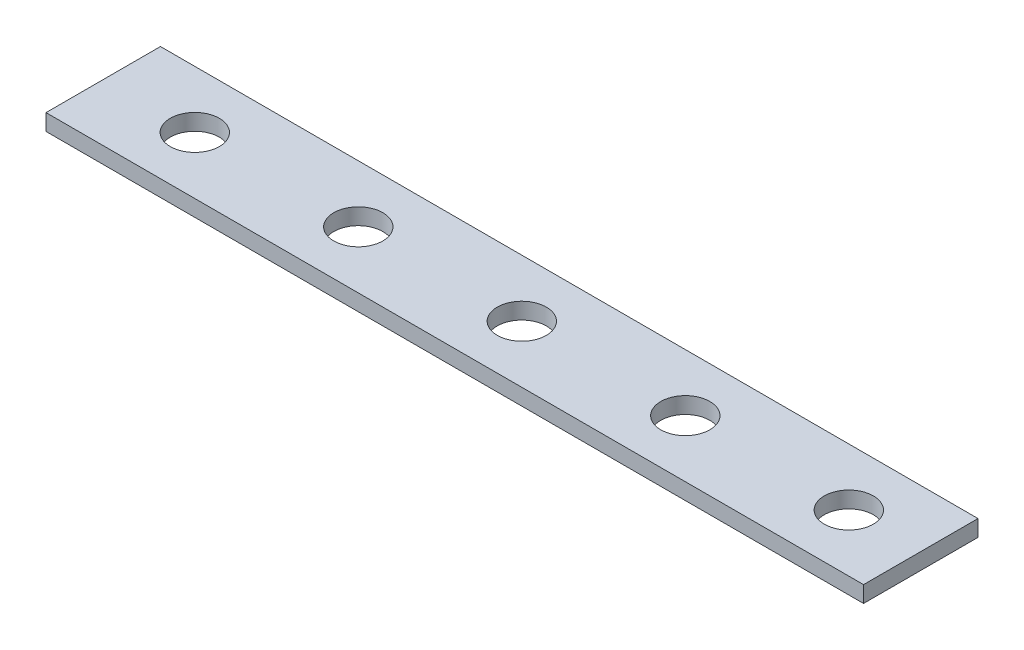
ISO-10303-21;
HEADER;
FILE_DESCRIPTION(('STEP AP214'),'2;1');
FILE_NAME('part.step','',(''),(''),'','','');
FILE_SCHEMA(('AUTOMOTIVE_DESIGN { 1 0 10303 214 1 1 1 1 }'));
ENDSEC;
DATA;
#1=APPLICATION_CONTEXT('core data for automotive mechanical design processes');
#2=APPLICATION_PROTOCOL_DEFINITION('international standard','automotive_design',2000,#1);
#3=PRODUCT_CONTEXT('',#1,'mechanical');
#4=PRODUCT('Part','Part','',(#3));
#5=PRODUCT_RELATED_PRODUCT_CATEGORY('part','',(#4));
#6=PRODUCT_DEFINITION_FORMATION('','',#4);
#7=PRODUCT_DEFINITION_CONTEXT('part definition',#1,'design');
#8=PRODUCT_DEFINITION('design','',#6,#7);
#9=PRODUCT_DEFINITION_SHAPE('','',#8);
#10=(LENGTH_UNIT() NAMED_UNIT(*) SI_UNIT(.MILLI.,.METRE.));
#11=(NAMED_UNIT(*) PLANE_ANGLE_UNIT() SI_UNIT($,.RADIAN.));
#12=(NAMED_UNIT(*) SI_UNIT($,.STERADIAN.) SOLID_ANGLE_UNIT());
#13=UNCERTAINTY_MEASURE_WITH_UNIT(LENGTH_MEASURE(1.E-05),#10,'distance_accuracy_value','');
#14=(GEOMETRIC_REPRESENTATION_CONTEXT(3) GLOBAL_UNCERTAINTY_ASSIGNED_CONTEXT((#13)) GLOBAL_UNIT_ASSIGNED_CONTEXT((#10,
#11,#12)) REPRESENTATION_CONTEXT('',''));
#15=CARTESIAN_POINT('',(0.,0.,0.));
#16=DIRECTION('',(0.,0.,1.));
#17=DIRECTION('',(1.,0.,0.));
#18=AXIS2_PLACEMENT_3D('',#15,#16,#17);
#19=CARTESIAN_POINT('',(-33.6,1.,-18.3166666666667));
#20=DIRECTION('',(1.,0.,0.));
#21=DIRECTION('',(0.,0.,-1.));
#22=AXIS2_PLACEMENT_3D('',#19,#20,#21);
#23=PLANE('',#22);
#24=DIRECTION('',(0.,0.,1.));
#25=VECTOR('',#24,1.);
#26=CARTESIAN_POINT('',(-33.6,0.,-18.3166666666667));
#27=LINE('',#26,#25);
#28=CARTESIAN_POINT('',(-33.6,0.,-18.3166666666667));
#29=VERTEX_POINT('',#28);
#30=CARTESIAN_POINT('',(-33.6,0.,-11.3166666666667));
#31=VERTEX_POINT('',#30);
#32=EDGE_CURVE('E102',#29,#31,#27,.T.);
#33=ORIENTED_EDGE('',*,*,#32,.T.);
#34=DIRECTION('',(0.,-1.,0.));
#35=VECTOR('',#34,1.);
#36=CARTESIAN_POINT('',(-33.6,1.,-11.3166666666667));
#37=LINE('',#36,#35);
#38=CARTESIAN_POINT('',(-33.6,1.,-11.3166666666667));
#39=VERTEX_POINT('',#38);
#40=EDGE_CURVE('E93',#39,#31,#37,.T.);
#41=ORIENTED_EDGE('',*,*,#40,.F.);
#42=DIRECTION('',(0.,0.,1.));
#43=VECTOR('',#42,1.);
#44=CARTESIAN_POINT('',(-33.6,1.,-18.3166666666667));
#45=LINE('',#44,#43);
#46=CARTESIAN_POINT('',(-33.6,1.,-18.3166666666667));
#47=VERTEX_POINT('',#46);
#48=EDGE_CURVE('E87',#47,#39,#45,.T.);
#49=ORIENTED_EDGE('',*,*,#48,.F.);
#50=DIRECTION('',(0.,-1.,0.));
#51=VECTOR('',#50,1.);
#52=CARTESIAN_POINT('',(-33.6,1.,-18.3166666666667));
#53=LINE('',#52,#51);
#54=EDGE_CURVE('E98',#47,#29,#53,.T.);
#55=ORIENTED_EDGE('',*,*,#54,.T.);
#56=EDGE_LOOP('',(#33,#41,#49,#55));
#57=FACE_BOUND('',#56,.T.);
#58=ADVANCED_FACE('F33',(#57),#23,.F.);
#59=CARTESIAN_POINT('',(-33.6,1.,-11.3166666666667));
#60=DIRECTION('',(0.,0.,-1.));
#61=DIRECTION('',(-1.,0.,0.));
#62=AXIS2_PLACEMENT_3D('',#59,#60,#61);
#63=PLANE('',#62);
#64=DIRECTION('',(1.,0.,0.));
#65=VECTOR('',#64,1.);
#66=CARTESIAN_POINT('',(-33.6,0.,-11.3166666666667));
#67=LINE('',#66,#65);
#68=CARTESIAN_POINT('',(16.4,0.,-11.3166666666667));
#69=VERTEX_POINT('',#68);
#70=EDGE_CURVE('E92',#31,#69,#67,.T.);
#71=ORIENTED_EDGE('',*,*,#70,.T.);
#72=DIRECTION('',(0.,-1.,0.));
#73=VECTOR('',#72,1.);
#74=CARTESIAN_POINT('',(16.4,1.,-11.3166666666667));
#75=LINE('',#74,#73);
#76=CARTESIAN_POINT('',(16.4,1.,-11.3166666666667));
#77=VERTEX_POINT('',#76);
#78=EDGE_CURVE('E90',#77,#69,#75,.T.);
#79=ORIENTED_EDGE('',*,*,#78,.F.);
#80=DIRECTION('',(1.,0.,0.));
#81=VECTOR('',#80,1.);
#82=CARTESIAN_POINT('',(-33.6,1.,-11.3166666666667));
#83=LINE('',#82,#81);
#84=EDGE_CURVE('E81',#39,#77,#83,.T.);
#85=ORIENTED_EDGE('',*,*,#84,.F.);
#86=ORIENTED_EDGE('',*,*,#40,.T.);
#87=EDGE_LOOP('',(#71,#79,#85,#86));
#88=FACE_BOUND('',#87,.T.);
#89=ADVANCED_FACE('F91',(#88),#63,.F.);
#90=CARTESIAN_POINT('',(16.4,1.,-18.3166666666667));
#91=DIRECTION('',(-1.,0.,0.));
#92=DIRECTION('',(0.,0.,1.));
#93=AXIS2_PLACEMENT_3D('',#90,#91,#92);
#94=PLANE('',#93);
#95=DIRECTION('',(0.,0.,-1.));
#96=VECTOR('',#95,1.);
#97=CARTESIAN_POINT('',(16.4,0.,-18.3166666666667));
#98=LINE('',#97,#96);
#99=CARTESIAN_POINT('',(16.4,0.,-18.3166666666667));
#100=VERTEX_POINT('',#99);
#101=EDGE_CURVE('E67',#69,#100,#98,.T.);
#102=ORIENTED_EDGE('',*,*,#101,.T.);
#103=DIRECTION('',(0.,-1.,0.));
#104=VECTOR('',#103,1.);
#105=CARTESIAN_POINT('',(16.4,1.,-18.3166666666667));
#106=LINE('',#105,#104);
#107=CARTESIAN_POINT('',(16.4,1.,-18.3166666666667));
#108=VERTEX_POINT('',#107);
#109=EDGE_CURVE('E94',#108,#100,#106,.T.);
#110=ORIENTED_EDGE('',*,*,#109,.F.);
#111=DIRECTION('',(0.,0.,-1.));
#112=VECTOR('',#111,1.);
#113=CARTESIAN_POINT('',(16.4,1.,-18.3166666666667));
#114=LINE('',#113,#112);
#115=EDGE_CURVE('E85',#77,#108,#114,.T.);
#116=ORIENTED_EDGE('',*,*,#115,.F.);
#117=ORIENTED_EDGE('',*,*,#78,.T.);
#118=EDGE_LOOP('',(#102,#110,#116,#117));
#119=FACE_BOUND('',#118,.T.);
#120=ADVANCED_FACE('F96',(#119),#94,.F.);
#121=CARTESIAN_POINT('',(-33.6,1.,-18.3166666666667));
#122=DIRECTION('',(0.,0.,1.));
#123=DIRECTION('',(1.,0.,0.));
#124=AXIS2_PLACEMENT_3D('',#121,#122,#123);
#125=PLANE('',#124);
#126=DIRECTION('',(-1.,0.,0.));
#127=VECTOR('',#126,1.);
#128=CARTESIAN_POINT('',(-33.6,0.,-18.3166666666667));
#129=LINE('',#128,#127);
#130=EDGE_CURVE('E73',#100,#29,#129,.T.);
#131=ORIENTED_EDGE('',*,*,#130,.T.);
#132=ORIENTED_EDGE('',*,*,#54,.F.);
#133=DIRECTION('',(-1.,0.,0.));
#134=VECTOR('',#133,1.);
#135=CARTESIAN_POINT('',(-33.6,1.,-18.3166666666667));
#136=LINE('',#135,#134);
#137=EDGE_CURVE('E50',#108,#47,#136,.T.);
#138=ORIENTED_EDGE('',*,*,#137,.F.);
#139=ORIENTED_EDGE('',*,*,#109,.T.);
#140=EDGE_LOOP('',(#131,#132,#138,#139));
#141=FACE_BOUND('',#140,.T.);
#142=ADVANCED_FACE('F134',(#141),#125,.F.);
#143=CARTESIAN_POINT('',(0.,1.,0.));
#144=DIRECTION('',(0.,1.,0.));
#145=DIRECTION('',(0.,0.,1.));
#146=AXIS2_PLACEMENT_3D('',#143,#144,#145);
#147=PLANE('',#146);
#148=CARTESIAN_POINT('',(-18.0001731889003,1.,-14.8166666666667));
#149=DIRECTION('',(0.,1.,0.));
#150=DIRECTION('',(0.,0.,1.));
#151=AXIS2_PLACEMENT_3D('',#148,#149,#150);
#152=CIRCLE('',#151,1.5);
#153=CARTESIAN_POINT('',(-18.0001731889003,1.,-13.3166666666667));
#154=VERTEX_POINT('',#153);
#155=EDGE_CURVE('E242',#154,#154,#152,.T.);
#156=ORIENTED_EDGE('',*,*,#155,.F.);
#157=EDGE_LOOP('',(#156));
#158=FACE_BOUND('',#157,.T.);
#159=CARTESIAN_POINT('',(-28.0001731889003,1.,-14.8166666666667));
#160=DIRECTION('',(0.,1.,0.));
#161=DIRECTION('',(0.,0.,1.));
#162=AXIS2_PLACEMENT_3D('',#159,#160,#161);
#163=CIRCLE('',#162,1.5);
#164=CARTESIAN_POINT('',(-28.0001731889003,1.,-13.3166666666667));
#165=VERTEX_POINT('',#164);
#166=EDGE_CURVE('E241',#165,#165,#163,.T.);
#167=ORIENTED_EDGE('',*,*,#166,.F.);
#168=EDGE_LOOP('',(#167));
#169=FACE_BOUND('',#168,.T.);
#170=ORIENTED_EDGE('',*,*,#48,.T.);
#171=ORIENTED_EDGE('',*,*,#84,.T.);
#172=ORIENTED_EDGE('',*,*,#115,.T.);
#173=ORIENTED_EDGE('',*,*,#137,.T.);
#174=EDGE_LOOP('',(#170,#171,#172,#173));
#175=FACE_BOUND('',#174,.T.);
#176=CARTESIAN_POINT('',(-8.00017318890033,1.,-14.8166666666667));
#177=DIRECTION('',(0.,1.,0.));
#178=DIRECTION('',(0.,0.,1.));
#179=AXIS2_PLACEMENT_3D('',#176,#177,#178);
#180=CIRCLE('',#179,1.5);
#181=CARTESIAN_POINT('',(-8.00017318890033,1.,-13.3166666666667));
#182=VERTEX_POINT('',#181);
#183=EDGE_CURVE('E115',#182,#182,#180,.T.);
#184=ORIENTED_EDGE('',*,*,#183,.F.);
#185=EDGE_LOOP('',(#184));
#186=FACE_BOUND('',#185,.T.);
#187=CARTESIAN_POINT('',(1.99982681109967,1.,-14.8166666666667));
#188=DIRECTION('',(0.,1.,0.));
#189=DIRECTION('',(0.,0.,1.));
#190=AXIS2_PLACEMENT_3D('',#187,#188,#189);
#191=CIRCLE('',#190,1.5);
#192=CARTESIAN_POINT('',(1.99982681109967,1.,-13.3166666666667));
#193=VERTEX_POINT('',#192);
#194=EDGE_CURVE('E121',#193,#193,#191,.T.);
#195=ORIENTED_EDGE('',*,*,#194,.F.);
#196=EDGE_LOOP('',(#195));
#197=FACE_BOUND('',#196,.T.);
#198=CARTESIAN_POINT('',(11.9998268110997,1.,-14.8166666666667));
#199=DIRECTION('',(0.,1.,0.));
#200=DIRECTION('',(0.,0.,1.));
#201=AXIS2_PLACEMENT_3D('',#198,#199,#200);
#202=CIRCLE('',#201,1.5);
#203=CARTESIAN_POINT('',(11.9998268110997,1.,-13.3166666666667));
#204=VERTEX_POINT('',#203);
#205=EDGE_CURVE('E11',#204,#204,#202,.T.);
#206=ORIENTED_EDGE('',*,*,#205,.F.);
#207=EDGE_LOOP('',(#206));
#208=FACE_BOUND('',#207,.T.);
#209=ADVANCED_FACE('F82',(#158,#169,#175,#186,#197,#208),#147,.T.);
#210=CARTESIAN_POINT('',(0.,0.,0.));
#211=DIRECTION('',(0.,1.,0.));
#212=DIRECTION('',(0.,0.,1.));
#213=AXIS2_PLACEMENT_3D('',#210,#211,#212);
#214=PLANE('',#213);
#215=CARTESIAN_POINT('',(-18.0001731889003,0.,-14.8166666666667));
#216=DIRECTION('',(0.,1.,0.));
#217=DIRECTION('',(0.,0.,1.));
#218=AXIS2_PLACEMENT_3D('',#215,#216,#217);
#219=CIRCLE('',#218,1.5);
#220=CARTESIAN_POINT('',(-18.0001731889003,0.,-13.3166666666667));
#221=VERTEX_POINT('',#220);
#222=EDGE_CURVE('E246',#221,#221,#219,.T.);
#223=ORIENTED_EDGE('',*,*,#222,.T.);
#224=EDGE_LOOP('',(#223));
#225=FACE_BOUND('',#224,.T.);
#226=CARTESIAN_POINT('',(-28.0001731889003,0.,-14.8166666666667));
#227=DIRECTION('',(0.,1.,0.));
#228=DIRECTION('',(0.,0.,1.));
#229=AXIS2_PLACEMENT_3D('',#226,#227,#228);
#230=CIRCLE('',#229,1.5);
#231=CARTESIAN_POINT('',(-28.0001731889003,0.,-13.3166666666667));
#232=VERTEX_POINT('',#231);
#233=EDGE_CURVE('E105',#232,#232,#230,.T.);
#234=ORIENTED_EDGE('',*,*,#233,.T.);
#235=EDGE_LOOP('',(#234));
#236=FACE_BOUND('',#235,.T.);
#237=ORIENTED_EDGE('',*,*,#32,.F.);
#238=ORIENTED_EDGE('',*,*,#130,.F.);
#239=ORIENTED_EDGE('',*,*,#101,.F.);
#240=ORIENTED_EDGE('',*,*,#70,.F.);
#241=EDGE_LOOP('',(#237,#238,#239,#240));
#242=FACE_BOUND('',#241,.T.);
#243=CARTESIAN_POINT('',(-8.00017318890033,0.,-14.8166666666667));
#244=DIRECTION('',(0.,1.,0.));
#245=DIRECTION('',(0.,0.,1.));
#246=AXIS2_PLACEMENT_3D('',#243,#244,#245);
#247=CIRCLE('',#246,1.5);
#248=CARTESIAN_POINT('',(-8.00017318890033,0.,-13.3166666666667));
#249=VERTEX_POINT('',#248);
#250=EDGE_CURVE('E112',#249,#249,#247,.T.);
#251=ORIENTED_EDGE('',*,*,#250,.T.);
#252=EDGE_LOOP('',(#251));
#253=FACE_BOUND('',#252,.T.);
#254=CARTESIAN_POINT('',(1.99982681109967,0.,-14.8166666666667));
#255=DIRECTION('',(0.,1.,0.));
#256=DIRECTION('',(0.,0.,1.));
#257=AXIS2_PLACEMENT_3D('',#254,#255,#256);
#258=CIRCLE('',#257,1.5);
#259=CARTESIAN_POINT('',(1.99982681109967,0.,-13.3166666666667));
#260=VERTEX_POINT('',#259);
#261=EDGE_CURVE('E118',#260,#260,#258,.T.);
#262=ORIENTED_EDGE('',*,*,#261,.T.);
#263=EDGE_LOOP('',(#262));
#264=FACE_BOUND('',#263,.T.);
#265=CARTESIAN_POINT('',(11.9998268110997,0.,-14.8166666666667));
#266=DIRECTION('',(0.,1.,0.));
#267=DIRECTION('',(0.,0.,1.));
#268=AXIS2_PLACEMENT_3D('',#265,#266,#267);
#269=CIRCLE('',#268,1.5);
#270=CARTESIAN_POINT('',(11.9998268110997,0.,-13.3166666666667));
#271=VERTEX_POINT('',#270);
#272=EDGE_CURVE('E42',#271,#271,#269,.T.);
#273=ORIENTED_EDGE('',*,*,#272,.T.);
#274=EDGE_LOOP('',(#273));
#275=FACE_BOUND('',#274,.T.);
#276=ADVANCED_FACE('F126',(#225,#236,#242,#253,#264,#275),#214,.F.);
#277=CARTESIAN_POINT('',(-28.0001731889003,0.,-14.8166666666667));
#278=DIRECTION('',(0.,1.,0.));
#279=DIRECTION('',(0.,0.,1.));
#280=AXIS2_PLACEMENT_3D('',#277,#278,#279);
#281=CYLINDRICAL_SURFACE('',#280,1.5);
#282=ORIENTED_EDGE('',*,*,#233,.F.);
#283=EDGE_LOOP('',(#282));
#284=FACE_BOUND('',#283,.T.);
#285=ORIENTED_EDGE('',*,*,#166,.T.);
#286=EDGE_LOOP('',(#285));
#287=FACE_BOUND('',#286,.T.);
#288=ADVANCED_FACE('F141',(#284,#287),#281,.F.);
#289=CARTESIAN_POINT('',(-18.0001731889003,0.,-14.8166666666667));
#290=DIRECTION('',(0.,1.,0.));
#291=DIRECTION('',(0.,0.,1.));
#292=AXIS2_PLACEMENT_3D('',#289,#290,#291);
#293=CYLINDRICAL_SURFACE('',#292,1.5);
#294=ORIENTED_EDGE('',*,*,#222,.F.);
#295=EDGE_LOOP('',(#294));
#296=FACE_BOUND('',#295,.T.);
#297=ORIENTED_EDGE('',*,*,#155,.T.);
#298=EDGE_LOOP('',(#297));
#299=FACE_BOUND('',#298,.T.);
#300=ADVANCED_FACE('F159',(#296,#299),#293,.F.);
#301=CARTESIAN_POINT('',(-8.00017318890033,0.,-14.8166666666667));
#302=DIRECTION('',(0.,1.,0.));
#303=DIRECTION('',(0.,0.,1.));
#304=AXIS2_PLACEMENT_3D('',#301,#302,#303);
#305=CYLINDRICAL_SURFACE('',#304,1.5);
#306=ORIENTED_EDGE('',*,*,#250,.F.);
#307=EDGE_LOOP('',(#306));
#308=FACE_BOUND('',#307,.T.);
#309=ORIENTED_EDGE('',*,*,#183,.T.);
#310=EDGE_LOOP('',(#309));
#311=FACE_BOUND('',#310,.T.);
#312=ADVANCED_FACE('F157',(#308,#311),#305,.F.);
#313=CARTESIAN_POINT('',(1.99982681109967,0.,-14.8166666666667));
#314=DIRECTION('',(0.,1.,0.));
#315=DIRECTION('',(0.,0.,1.));
#316=AXIS2_PLACEMENT_3D('',#313,#314,#315);
#317=CYLINDRICAL_SURFACE('',#316,1.5);
#318=ORIENTED_EDGE('',*,*,#261,.F.);
#319=EDGE_LOOP('',(#318));
#320=FACE_BOUND('',#319,.T.);
#321=ORIENTED_EDGE('',*,*,#194,.T.);
#322=EDGE_LOOP('',(#321));
#323=FACE_BOUND('',#322,.T.);
#324=ADVANCED_FACE('F130',(#320,#323),#317,.F.);
#325=CARTESIAN_POINT('',(11.9998268110997,0.,-14.8166666666667));
#326=DIRECTION('',(0.,1.,0.));
#327=DIRECTION('',(0.,0.,1.));
#328=AXIS2_PLACEMENT_3D('',#325,#326,#327);
#329=CYLINDRICAL_SURFACE('',#328,1.5);
#330=ORIENTED_EDGE('',*,*,#272,.F.);
#331=EDGE_LOOP('',(#330));
#332=FACE_BOUND('',#331,.T.);
#333=ORIENTED_EDGE('',*,*,#205,.T.);
#334=EDGE_LOOP('',(#333));
#335=FACE_BOUND('',#334,.T.);
#336=ADVANCED_FACE('F35',(#332,#335),#329,.F.);
#337=CLOSED_SHELL('',(#58,#89,#120,#142,#209,#276,#288,#300,#312,#324,#336));
#338=MANIFOLD_SOLID_BREP('B2',#337);
#339=ADVANCED_BREP_SHAPE_REPRESENTATION('',(#18,#338),#14);
#340=SHAPE_DEFINITION_REPRESENTATION(#9,#339);
ENDSEC;
END-ISO-10303-21;
